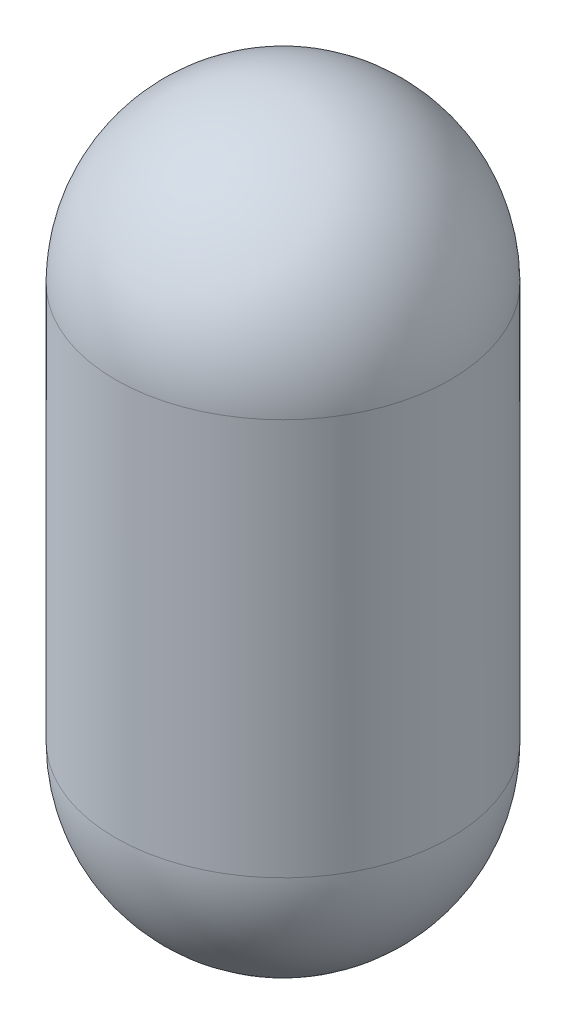
ISO-10303-21;
HEADER;
FILE_DESCRIPTION(('STEP AP214'),'2;1');
FILE_NAME('part.step','',(''),(''),'','','');
FILE_SCHEMA(('AUTOMOTIVE_DESIGN { 1 0 10303 214 1 1 1 1 }'));
ENDSEC;
DATA;
#1=APPLICATION_CONTEXT('core data for automotive mechanical design processes');
#2=APPLICATION_PROTOCOL_DEFINITION('international standard','automotive_design',2000,#1);
#3=PRODUCT_CONTEXT('',#1,'mechanical');
#4=PRODUCT('Part','Part','',(#3));
#5=PRODUCT_RELATED_PRODUCT_CATEGORY('part','',(#4));
#6=PRODUCT_DEFINITION_FORMATION('','',#4);
#7=PRODUCT_DEFINITION_CONTEXT('part definition',#1,'design');
#8=PRODUCT_DEFINITION('design','',#6,#7);
#9=PRODUCT_DEFINITION_SHAPE('','',#8);
#10=(LENGTH_UNIT() NAMED_UNIT(*) SI_UNIT(.MILLI.,.METRE.));
#11=(NAMED_UNIT(*) PLANE_ANGLE_UNIT() SI_UNIT($,.RADIAN.));
#12=(NAMED_UNIT(*) SI_UNIT($,.STERADIAN.) SOLID_ANGLE_UNIT());
#13=UNCERTAINTY_MEASURE_WITH_UNIT(LENGTH_MEASURE(1.E-05),#10,'distance_accuracy_value','');
#14=(GEOMETRIC_REPRESENTATION_CONTEXT(3) GLOBAL_UNCERTAINTY_ASSIGNED_CONTEXT((#13)) GLOBAL_UNIT_ASSIGNED_CONTEXT((#10,
#11,#12)) REPRESENTATION_CONTEXT('',''));
#15=CARTESIAN_POINT('',(0.,0.,0.));
#16=DIRECTION('',(0.,0.,1.));
#17=DIRECTION('',(1.,0.,0.));
#18=AXIS2_PLACEMENT_3D('',#15,#16,#17);
#19=CARTESIAN_POINT('',(0.,87.9475,0.));
#20=DIRECTION('',(0.,1.,0.));
#21=DIRECTION('',(1.,0.,0.));
#22=AXIS2_PLACEMENT_3D('',#19,#20,#21);
#23=SPHERICAL_SURFACE('',#22,74.295);
#24=CARTESIAN_POINT('',(0.,87.9475,0.));
#25=DIRECTION('',(0.,1.,0.));
#26=DIRECTION('',(0.,0.,1.));
#27=AXIS2_PLACEMENT_3D('',#24,#25,#26);
#28=CIRCLE('',#27,74.295);
#29=CARTESIAN_POINT('',(0.,87.9475,74.295));
#30=VERTEX_POINT('',#29);
#31=EDGE_CURVE('E10',#30,#30,#28,.T.);
#32=ORIENTED_EDGE('',*,*,#31,.T.);
#33=EDGE_LOOP('',(#32));
#34=FACE_BOUND('',#33,.T.);
#35=ADVANCED_FACE('F35',(#34),#23,.T.);
#36=CARTESIAN_POINT('',(0.,87.9475,0.));
#37=DIRECTION('',(0.,1.,0.));
#38=DIRECTION('',(0.,0.,1.));
#39=AXIS2_PLACEMENT_3D('',#36,#37,#38);
#40=CYLINDRICAL_SURFACE('',#39,74.295);
#41=CARTESIAN_POINT('',(0.,-87.9475,0.));
#42=DIRECTION('',(0.,1.,0.));
#43=DIRECTION('',(0.,0.,1.));
#44=AXIS2_PLACEMENT_3D('',#41,#42,#43);
#45=CIRCLE('',#44,74.295);
#46=CARTESIAN_POINT('',(0.,-87.9475,74.295));
#47=VERTEX_POINT('',#46);
#48=EDGE_CURVE('E42',#47,#47,#45,.T.);
#49=ORIENTED_EDGE('',*,*,#48,.T.);
#50=EDGE_LOOP('',(#49));
#51=FACE_BOUND('',#50,.T.);
#52=ORIENTED_EDGE('',*,*,#31,.F.);
#53=EDGE_LOOP('',(#52));
#54=FACE_BOUND('',#53,.T.);
#55=ADVANCED_FACE('F76',(#51,#54),#40,.T.);
#56=CARTESIAN_POINT('',(0.,-87.9475,0.));
#57=DIRECTION('',(0.,1.,0.));
#58=DIRECTION('',(-1.,0.,0.));
#59=AXIS2_PLACEMENT_3D('',#56,#57,#58);
#60=SPHERICAL_SURFACE('',#59,74.295);
#61=ORIENTED_EDGE('',*,*,#48,.F.);
#62=EDGE_LOOP('',(#61));
#63=FACE_BOUND('',#62,.T.);
#64=ADVANCED_FACE('F75',(#63),#60,.T.);
#65=CLOSED_SHELL('',(#35,#55,#64));
#66=CARTESIAN_POINT('',(0.,-87.9475,0.));
#67=DIRECTION('',(0.,1.,0.));
#68=DIRECTION('',(1.,0.,0.));
#69=AXIS2_PLACEMENT_3D('',#66,#67,#68);
#70=SPHERICAL_SURFACE('',#69,71.12);
#71=CARTESIAN_POINT('',(0.,-87.9475,0.));
#72=DIRECTION('',(0.,1.,0.));
#73=DIRECTION('',(0.,0.,1.));
#74=AXIS2_PLACEMENT_3D('',#71,#72,#73);
#75=CIRCLE('',#74,71.12);
#76=CARTESIAN_POINT('',(0.,-87.9475,71.12));
#77=VERTEX_POINT('',#76);
#78=EDGE_CURVE('E46',#77,#77,#75,.T.);
#79=ORIENTED_EDGE('',*,*,#78,.T.);
#80=EDGE_LOOP('',(#79));
#81=FACE_BOUND('',#80,.T.);
#82=ADVANCED_FACE('F66',(#81),#70,.F.);
#83=CARTESIAN_POINT('',(0.,87.9475,0.));
#84=DIRECTION('',(0.,1.,0.));
#85=DIRECTION('',(0.,0.,1.));
#86=AXIS2_PLACEMENT_3D('',#83,#84,#85);
#87=CYLINDRICAL_SURFACE('',#86,71.12);
#88=CARTESIAN_POINT('',(0.,87.9475,0.));
#89=DIRECTION('',(0.,1.,0.));
#90=DIRECTION('',(0.,0.,1.));
#91=AXIS2_PLACEMENT_3D('',#88,#89,#90);
#92=CIRCLE('',#91,71.12);
#93=CARTESIAN_POINT('',(0.,87.9475,71.12));
#94=VERTEX_POINT('',#93);
#95=EDGE_CURVE('E50',#94,#94,#92,.T.);
#96=ORIENTED_EDGE('',*,*,#95,.T.);
#97=EDGE_LOOP('',(#96));
#98=FACE_BOUND('',#97,.T.);
#99=ORIENTED_EDGE('',*,*,#78,.F.);
#100=EDGE_LOOP('',(#99));
#101=FACE_BOUND('',#100,.T.);
#102=ADVANCED_FACE('F56',(#98,#101),#87,.F.);
#103=CARTESIAN_POINT('',(0.,87.9475,0.));
#104=DIRECTION('',(0.,1.,0.));
#105=DIRECTION('',(-1.,0.,0.));
#106=AXIS2_PLACEMENT_3D('',#103,#104,#105);
#107=SPHERICAL_SURFACE('',#106,71.12);
#108=ORIENTED_EDGE('',*,*,#95,.F.);
#109=EDGE_LOOP('',(#108));
#110=FACE_BOUND('',#109,.T.);
#111=ADVANCED_FACE('F59',(#110),#107,.F.);
#112=CLOSED_SHELL('',(#82,#102,#111));
#113=ORIENTED_CLOSED_SHELL('',*,#112,.T.);
#114=BREP_WITH_VOIDS('B2',#65,(#113));
#115=ADVANCED_BREP_SHAPE_REPRESENTATION('',(#18,#114),#14);
#116=SHAPE_DEFINITION_REPRESENTATION(#9,#115);
ENDSEC;
END-ISO-10303-21;
